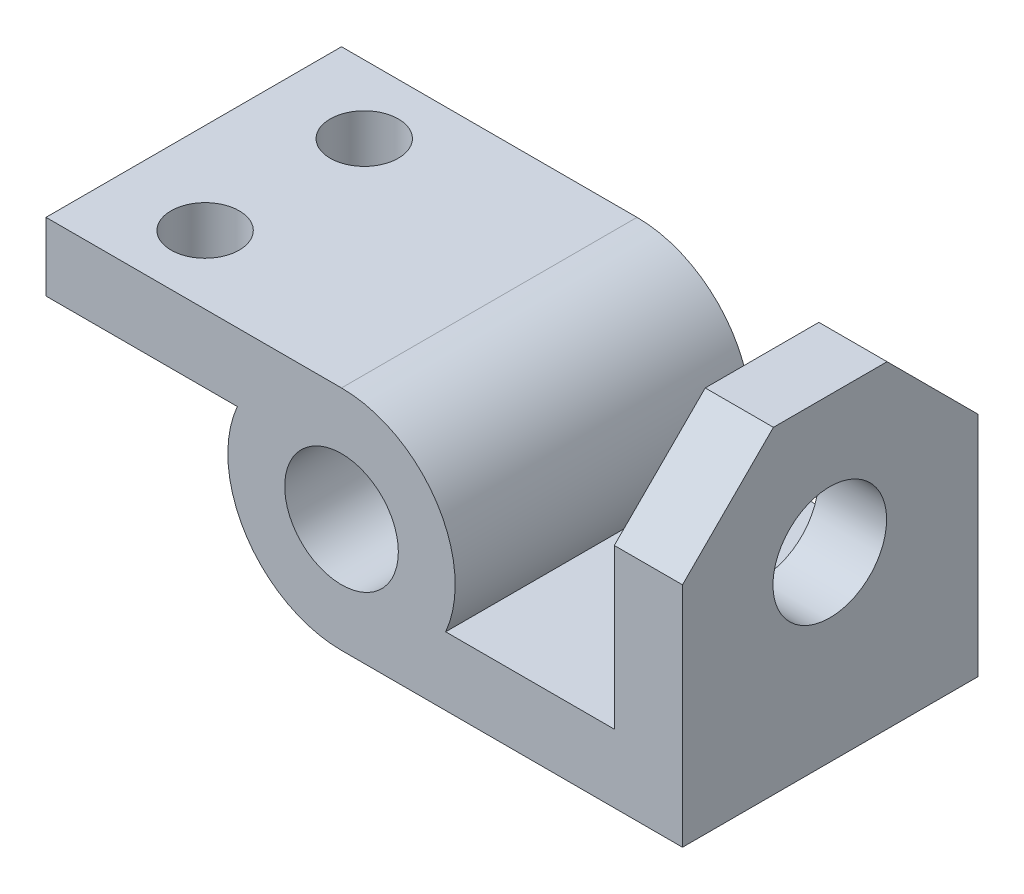
ISO-10303-21;
HEADER;
FILE_DESCRIPTION(('STEP AP214'),'2;1');
FILE_NAME('part.step','',(''),(''),'','','');
FILE_SCHEMA(('AUTOMOTIVE_DESIGN { 1 0 10303 214 1 1 1 1 }'));
ENDSEC;
DATA;
#1=APPLICATION_CONTEXT('core data for automotive mechanical design processes');
#2=APPLICATION_PROTOCOL_DEFINITION('international standard','automotive_design',2000,#1);
#3=PRODUCT_CONTEXT('',#1,'mechanical');
#4=PRODUCT('Part','Part','',(#3));
#5=PRODUCT_RELATED_PRODUCT_CATEGORY('part','',(#4));
#6=PRODUCT_DEFINITION_FORMATION('','',#4);
#7=PRODUCT_DEFINITION_CONTEXT('part definition',#1,'design');
#8=PRODUCT_DEFINITION('design','',#6,#7);
#9=PRODUCT_DEFINITION_SHAPE('','',#8);
#10=(LENGTH_UNIT() NAMED_UNIT(*) SI_UNIT(.MILLI.,.METRE.));
#11=(NAMED_UNIT(*) PLANE_ANGLE_UNIT() SI_UNIT($,.RADIAN.));
#12=(NAMED_UNIT(*) SI_UNIT($,.STERADIAN.) SOLID_ANGLE_UNIT());
#13=UNCERTAINTY_MEASURE_WITH_UNIT(LENGTH_MEASURE(1.E-05),#10,'distance_accuracy_value','');
#14=(GEOMETRIC_REPRESENTATION_CONTEXT(3) GLOBAL_UNCERTAINTY_ASSIGNED_CONTEXT((#13)) GLOBAL_UNIT_ASSIGNED_CONTEXT((#10,
#11,#12)) REPRESENTATION_CONTEXT('',''));
#15=CARTESIAN_POINT('',(0.,0.,0.));
#16=DIRECTION('',(0.,0.,1.));
#17=DIRECTION('',(1.,0.,0.));
#18=AXIS2_PLACEMENT_3D('',#15,#16,#17);
#19=CARTESIAN_POINT('',(0.,0.,82.55));
#20=DIRECTION('',(0.,0.,1.));
#21=DIRECTION('',(1.,0.,0.));
#22=AXIS2_PLACEMENT_3D('',#19,#20,#21);
#23=PLANE('',#22);
#24=DIRECTION('',(0.,1.,0.));
#25=VECTOR('',#24,1.);
#26=CARTESIAN_POINT('',(95.25,-31.75,82.55));
#27=LINE('',#26,#25);
#28=CARTESIAN_POINT('',(95.25,-31.75,82.55));
#29=VERTEX_POINT('',#28);
#30=CARTESIAN_POINT('',(95.25,31.75,82.55));
#31=VERTEX_POINT('',#30);
#32=EDGE_CURVE('E275',#29,#31,#27,.T.);
#33=ORIENTED_EDGE('',*,*,#32,.T.);
#34=DIRECTION('',(-1.,0.,0.));
#35=VECTOR('',#34,1.);
#36=CARTESIAN_POINT('',(76.2,31.75,82.55));
#37=LINE('',#36,#35);
#38=CARTESIAN_POINT('',(76.2,31.75,82.55));
#39=VERTEX_POINT('',#38);
#40=EDGE_CURVE('E11',#31,#39,#37,.T.);
#41=ORIENTED_EDGE('',*,*,#40,.T.);
#42=DIRECTION('',(0.,-1.,0.));
#43=VECTOR('',#42,1.);
#44=CARTESIAN_POINT('',(76.2,57.15,82.55));
#45=LINE('',#44,#43);
#46=CARTESIAN_POINT('',(76.2,-12.7,82.55));
#47=VERTEX_POINT('',#46);
#48=EDGE_CURVE('E278',#39,#47,#45,.T.);
#49=ORIENTED_EDGE('',*,*,#48,.T.);
#50=DIRECTION('',(-1.,0.,0.));
#51=VECTOR('',#50,1.);
#52=CARTESIAN_POINT('',(76.2,-12.7,82.55));
#53=LINE('',#52,#51);
#54=CARTESIAN_POINT('',(29.0993556629696,-12.7,82.55));
#55=VERTEX_POINT('',#54);
#56=EDGE_CURVE('E159',#47,#55,#53,.T.);
#57=ORIENTED_EDGE('',*,*,#56,.T.);
#58=CARTESIAN_POINT('',(0.,0.,82.55));
#59=DIRECTION('',(0.,0.,1.));
#60=DIRECTION('',(1.,0.,0.));
#61=AXIS2_PLACEMENT_3D('',#58,#59,#60);
#62=CIRCLE('',#61,31.75);
#63=CARTESIAN_POINT('',(0.,31.75,82.55));
#64=VERTEX_POINT('',#63);
#65=EDGE_CURVE('E154',#55,#64,#62,.T.);
#66=ORIENTED_EDGE('',*,*,#65,.T.);
#67=DIRECTION('',(-1.,0.,0.));
#68=VECTOR('',#67,1.);
#69=CARTESIAN_POINT('',(0.,31.75,82.55));
#70=LINE('',#69,#68);
#71=CARTESIAN_POINT('',(-82.55,31.75,82.55));
#72=VERTEX_POINT('',#71);
#73=EDGE_CURVE('E142',#64,#72,#70,.T.);
#74=ORIENTED_EDGE('',*,*,#73,.T.);
#75=DIRECTION('',(0.,-1.,0.));
#76=VECTOR('',#75,1.);
#77=CARTESIAN_POINT('',(-82.55,31.75,82.55));
#78=LINE('',#77,#76);
#79=CARTESIAN_POINT('',(-82.55,12.7,82.55));
#80=VERTEX_POINT('',#79);
#81=EDGE_CURVE('E153',#72,#80,#78,.T.);
#82=ORIENTED_EDGE('',*,*,#81,.T.);
#83=DIRECTION('',(1.,0.,0.));
#84=VECTOR('',#83,1.);
#85=CARTESIAN_POINT('',(-82.55,12.7,82.55));
#86=LINE('',#85,#84);
#87=CARTESIAN_POINT('',(-29.0993556629696,12.7,82.55));
#88=VERTEX_POINT('',#87);
#89=EDGE_CURVE('E254',#80,#88,#86,.T.);
#90=ORIENTED_EDGE('',*,*,#89,.T.);
#91=CARTESIAN_POINT('',(0.,0.,82.55));
#92=DIRECTION('',(0.,0.,1.));
#93=DIRECTION('',(1.,0.,0.));
#94=AXIS2_PLACEMENT_3D('',#91,#92,#93);
#95=CIRCLE('',#94,31.75);
#96=CARTESIAN_POINT('',(0.,-31.75,82.55));
#97=VERTEX_POINT('',#96);
#98=EDGE_CURVE('E284',#88,#97,#95,.T.);
#99=ORIENTED_EDGE('',*,*,#98,.T.);
#100=DIRECTION('',(1.,0.,0.));
#101=VECTOR('',#100,1.);
#102=CARTESIAN_POINT('',(0.,-31.75,82.55));
#103=LINE('',#102,#101);
#104=EDGE_CURVE('E279',#97,#29,#103,.T.);
#105=ORIENTED_EDGE('',*,*,#104,.T.);
#106=EDGE_LOOP('',(#33,#41,#49,#57,#66,#74,#82,#90,#99,#105));
#107=FACE_BOUND('',#106,.T.);
#108=CARTESIAN_POINT('',(0.,0.,82.55));
#109=DIRECTION('',(0.,0.,1.));
#110=DIRECTION('',(1.,0.,0.));
#111=AXIS2_PLACEMENT_3D('',#108,#109,#110);
#112=CIRCLE('',#111,15.875);
#113=CARTESIAN_POINT('',(15.875,0.,82.55));
#114=VERTEX_POINT('',#113);
#115=EDGE_CURVE('E291',#114,#114,#112,.T.);
#116=ORIENTED_EDGE('',*,*,#115,.F.);
#117=EDGE_LOOP('',(#116));
#118=FACE_BOUND('',#117,.T.);
#119=ADVANCED_FACE('F47',(#107,#118),#23,.T.);
#120=CARTESIAN_POINT('',(0.,0.,0.));
#121=DIRECTION('',(0.,0.,1.));
#122=DIRECTION('',(1.,0.,0.));
#123=AXIS2_PLACEMENT_3D('',#120,#121,#122);
#124=PLANE('',#123);
#125=DIRECTION('',(0.,-1.,0.));
#126=VECTOR('',#125,1.);
#127=CARTESIAN_POINT('',(76.2,57.15,0.));
#128=LINE('',#127,#126);
#129=CARTESIAN_POINT('',(76.2,31.75,0.));
#130=VERTEX_POINT('',#129);
#131=CARTESIAN_POINT('',(76.2,-12.7,0.));
#132=VERTEX_POINT('',#131);
#133=EDGE_CURVE('E214',#130,#132,#128,.T.);
#134=ORIENTED_EDGE('',*,*,#133,.F.);
#135=DIRECTION('',(1.,0.,0.));
#136=VECTOR('',#135,1.);
#137=CARTESIAN_POINT('',(0.,31.75,0.));
#138=LINE('',#137,#136);
#139=CARTESIAN_POINT('',(95.25,31.75,0.));
#140=VERTEX_POINT('',#139);
#141=EDGE_CURVE('E72',#130,#140,#138,.T.);
#142=ORIENTED_EDGE('',*,*,#141,.T.);
#143=DIRECTION('',(0.,1.,0.));
#144=VECTOR('',#143,1.);
#145=CARTESIAN_POINT('',(95.25,-31.75,0.));
#146=LINE('',#145,#144);
#147=CARTESIAN_POINT('',(95.25,-31.75,0.));
#148=VERTEX_POINT('',#147);
#149=EDGE_CURVE('E198',#148,#140,#146,.T.);
#150=ORIENTED_EDGE('',*,*,#149,.F.);
#151=DIRECTION('',(1.,0.,0.));
#152=VECTOR('',#151,1.);
#153=CARTESIAN_POINT('',(0.,-31.75,0.));
#154=LINE('',#153,#152);
#155=CARTESIAN_POINT('',(0.,-31.75,0.));
#156=VERTEX_POINT('',#155);
#157=EDGE_CURVE('E224',#156,#148,#154,.T.);
#158=ORIENTED_EDGE('',*,*,#157,.F.);
#159=CARTESIAN_POINT('',(0.,0.,0.));
#160=DIRECTION('',(0.,0.,1.));
#161=DIRECTION('',(1.,0.,0.));
#162=AXIS2_PLACEMENT_3D('',#159,#160,#161);
#163=CIRCLE('',#162,31.75);
#164=CARTESIAN_POINT('',(-29.0993556629696,12.7,0.));
#165=VERTEX_POINT('',#164);
#166=EDGE_CURVE('E260',#165,#156,#163,.T.);
#167=ORIENTED_EDGE('',*,*,#166,.F.);
#168=DIRECTION('',(1.,0.,0.));
#169=VECTOR('',#168,1.);
#170=CARTESIAN_POINT('',(-82.55,12.7,0.));
#171=LINE('',#170,#169);
#172=CARTESIAN_POINT('',(-82.55,12.7,0.));
#173=VERTEX_POINT('',#172);
#174=EDGE_CURVE('E253',#173,#165,#171,.T.);
#175=ORIENTED_EDGE('',*,*,#174,.F.);
#176=DIRECTION('',(0.,-1.,0.));
#177=VECTOR('',#176,1.);
#178=CARTESIAN_POINT('',(-82.55,31.75,0.));
#179=LINE('',#178,#177);
#180=CARTESIAN_POINT('',(-82.55,31.75,0.));
#181=VERTEX_POINT('',#180);
#182=EDGE_CURVE('E258',#181,#173,#179,.T.);
#183=ORIENTED_EDGE('',*,*,#182,.F.);
#184=DIRECTION('',(-1.,0.,0.));
#185=VECTOR('',#184,1.);
#186=CARTESIAN_POINT('',(0.,31.75,0.));
#187=LINE('',#186,#185);
#188=CARTESIAN_POINT('',(0.,31.75,0.));
#189=VERTEX_POINT('',#188);
#190=EDGE_CURVE('E266',#189,#181,#187,.T.);
#191=ORIENTED_EDGE('',*,*,#190,.F.);
#192=CARTESIAN_POINT('',(0.,0.,0.));
#193=DIRECTION('',(0.,0.,1.));
#194=DIRECTION('',(1.,0.,0.));
#195=AXIS2_PLACEMENT_3D('',#192,#193,#194);
#196=CIRCLE('',#195,31.75);
#197=CARTESIAN_POINT('',(29.0993556629696,-12.7,0.));
#198=VERTEX_POINT('',#197);
#199=EDGE_CURVE('E168',#198,#189,#196,.T.);
#200=ORIENTED_EDGE('',*,*,#199,.F.);
#201=DIRECTION('',(-1.,0.,0.));
#202=VECTOR('',#201,1.);
#203=CARTESIAN_POINT('',(76.2,-12.7,0.));
#204=LINE('',#203,#202);
#205=EDGE_CURVE('E164',#132,#198,#204,.T.);
#206=ORIENTED_EDGE('',*,*,#205,.F.);
#207=EDGE_LOOP('',(#134,#142,#150,#158,#167,#175,#183,#191,#200,#206));
#208=FACE_BOUND('',#207,.T.);
#209=CARTESIAN_POINT('',(0.,0.,0.));
#210=DIRECTION('',(0.,0.,1.));
#211=DIRECTION('',(1.,0.,0.));
#212=AXIS2_PLACEMENT_3D('',#209,#210,#211);
#213=CIRCLE('',#212,15.875);
#214=CARTESIAN_POINT('',(15.875,0.,0.));
#215=VERTEX_POINT('',#214);
#216=EDGE_CURVE('E353',#215,#215,#213,.T.);
#217=ORIENTED_EDGE('',*,*,#216,.T.);
#218=EDGE_LOOP('',(#217));
#219=FACE_BOUND('',#218,.T.);
#220=ADVANCED_FACE('F217',(#208,#219),#124,.F.);
#221=CARTESIAN_POINT('',(0.,0.,82.55));
#222=DIRECTION('',(0.,0.,-1.));
#223=DIRECTION('',(-1.,0.,0.));
#224=AXIS2_PLACEMENT_3D('',#221,#222,#223);
#225=CYLINDRICAL_SURFACE('',#224,31.75);
#226=ORIENTED_EDGE('',*,*,#199,.T.);
#227=DIRECTION('',(0.,0.,-1.));
#228=VECTOR('',#227,1.);
#229=CARTESIAN_POINT('',(0.,31.75,82.55));
#230=LINE('',#229,#228);
#231=EDGE_CURVE('E146',#64,#189,#230,.T.);
#232=ORIENTED_EDGE('',*,*,#231,.F.);
#233=ORIENTED_EDGE('',*,*,#65,.F.);
#234=DIRECTION('',(0.,0.,-1.));
#235=VECTOR('',#234,1.);
#236=CARTESIAN_POINT('',(29.0993556629696,-12.7,82.55));
#237=LINE('',#236,#235);
#238=EDGE_CURVE('E228',#55,#198,#237,.T.);
#239=ORIENTED_EDGE('',*,*,#238,.T.);
#240=EDGE_LOOP('',(#226,#232,#233,#239));
#241=FACE_BOUND('',#240,.T.);
#242=ADVANCED_FACE('F166',(#241),#225,.T.);
#243=CARTESIAN_POINT('',(0.,31.75,82.55));
#244=DIRECTION('',(0.,-1.,0.));
#245=DIRECTION('',(1.,0.,0.));
#246=AXIS2_PLACEMENT_3D('',#243,#244,#245);
#247=PLANE('',#246);
#248=CARTESIAN_POINT('',(-57.15,31.75,63.5));
#249=DIRECTION('',(0.,1.,0.));
#250=DIRECTION('',(-1.,0.,0.));
#251=AXIS2_PLACEMENT_3D('',#248,#249,#250);
#252=CIRCLE('',#251,9.525);
#253=CARTESIAN_POINT('',(-66.675,31.75,63.5));
#254=VERTEX_POINT('',#253);
#255=EDGE_CURVE('E354',#254,#254,#252,.T.);
#256=ORIENTED_EDGE('',*,*,#255,.F.);
#257=EDGE_LOOP('',(#256));
#258=FACE_BOUND('',#257,.T.);
#259=CARTESIAN_POINT('',(-57.15,31.75,19.05));
#260=DIRECTION('',(0.,1.,0.));
#261=DIRECTION('',(-1.,0.,0.));
#262=AXIS2_PLACEMENT_3D('',#259,#260,#261);
#263=CIRCLE('',#262,9.525);
#264=CARTESIAN_POINT('',(-66.675,31.75,19.05));
#265=VERTEX_POINT('',#264);
#266=EDGE_CURVE('E358',#265,#265,#263,.T.);
#267=ORIENTED_EDGE('',*,*,#266,.F.);
#268=EDGE_LOOP('',(#267));
#269=FACE_BOUND('',#268,.T.);
#270=ORIENTED_EDGE('',*,*,#190,.T.);
#271=DIRECTION('',(0.,0.,-1.));
#272=VECTOR('',#271,1.);
#273=CARTESIAN_POINT('',(-82.55,31.75,82.55));
#274=LINE('',#273,#272);
#275=EDGE_CURVE('E149',#72,#181,#274,.T.);
#276=ORIENTED_EDGE('',*,*,#275,.F.);
#277=ORIENTED_EDGE('',*,*,#73,.F.);
#278=ORIENTED_EDGE('',*,*,#231,.T.);
#279=EDGE_LOOP('',(#270,#276,#277,#278));
#280=FACE_BOUND('',#279,.T.);
#281=ADVANCED_FACE('F144',(#258,#269,#280),#247,.F.);
#282=CARTESIAN_POINT('',(-82.55,31.75,82.55));
#283=DIRECTION('',(1.,0.,0.));
#284=DIRECTION('',(0.,0.,-1.));
#285=AXIS2_PLACEMENT_3D('',#282,#283,#284);
#286=PLANE('',#285);
#287=ORIENTED_EDGE('',*,*,#182,.T.);
#288=DIRECTION('',(0.,0.,-1.));
#289=VECTOR('',#288,1.);
#290=CARTESIAN_POINT('',(-82.55,12.7,82.55));
#291=LINE('',#290,#289);
#292=EDGE_CURVE('E176',#80,#173,#291,.T.);
#293=ORIENTED_EDGE('',*,*,#292,.F.);
#294=ORIENTED_EDGE('',*,*,#81,.F.);
#295=ORIENTED_EDGE('',*,*,#275,.T.);
#296=EDGE_LOOP('',(#287,#293,#294,#295));
#297=FACE_BOUND('',#296,.T.);
#298=ADVANCED_FACE('F293',(#297),#286,.F.);
#299=CARTESIAN_POINT('',(-82.55,12.7,82.55));
#300=DIRECTION('',(0.,1.,0.));
#301=DIRECTION('',(0.,0.,1.));
#302=AXIS2_PLACEMENT_3D('',#299,#300,#301);
#303=PLANE('',#302);
#304=CARTESIAN_POINT('',(-57.15,12.7,63.5));
#305=DIRECTION('',(0.,1.,0.));
#306=DIRECTION('',(-1.,0.,0.));
#307=AXIS2_PLACEMENT_3D('',#304,#305,#306);
#308=CIRCLE('',#307,9.525);
#309=CARTESIAN_POINT('',(-66.675,12.7,63.5));
#310=VERTEX_POINT('',#309);
#311=EDGE_CURVE('E349',#310,#310,#308,.T.);
#312=ORIENTED_EDGE('',*,*,#311,.T.);
#313=EDGE_LOOP('',(#312));
#314=FACE_BOUND('',#313,.T.);
#315=CARTESIAN_POINT('',(-57.15,12.7,19.05));
#316=DIRECTION('',(0.,1.,0.));
#317=DIRECTION('',(-1.,0.,0.));
#318=AXIS2_PLACEMENT_3D('',#315,#316,#317);
#319=CIRCLE('',#318,9.525);
#320=CARTESIAN_POINT('',(-66.675,12.7,19.05));
#321=VERTEX_POINT('',#320);
#322=EDGE_CURVE('E346',#321,#321,#319,.T.);
#323=ORIENTED_EDGE('',*,*,#322,.T.);
#324=EDGE_LOOP('',(#323));
#325=FACE_BOUND('',#324,.T.);
#326=ORIENTED_EDGE('',*,*,#174,.T.);
#327=DIRECTION('',(0.,0.,-1.));
#328=VECTOR('',#327,1.);
#329=CARTESIAN_POINT('',(-29.0993556629696,12.7,82.55));
#330=LINE('',#329,#328);
#331=EDGE_CURVE('E242',#88,#165,#330,.T.);
#332=ORIENTED_EDGE('',*,*,#331,.F.);
#333=ORIENTED_EDGE('',*,*,#89,.F.);
#334=ORIENTED_EDGE('',*,*,#292,.T.);
#335=EDGE_LOOP('',(#326,#332,#333,#334));
#336=FACE_BOUND('',#335,.T.);
#337=ADVANCED_FACE('F251',(#314,#325,#336),#303,.F.);
#338=CARTESIAN_POINT('',(0.,0.,82.55));
#339=DIRECTION('',(0.,0.,-1.));
#340=DIRECTION('',(-1.,0.,0.));
#341=AXIS2_PLACEMENT_3D('',#338,#339,#340);
#342=CYLINDRICAL_SURFACE('',#341,31.75);
#343=ORIENTED_EDGE('',*,*,#166,.T.);
#344=DIRECTION('',(0.,0.,-1.));
#345=VECTOR('',#344,1.);
#346=CARTESIAN_POINT('',(0.,-31.75,82.55));
#347=LINE('',#346,#345);
#348=EDGE_CURVE('E238',#97,#156,#347,.T.);
#349=ORIENTED_EDGE('',*,*,#348,.F.);
#350=ORIENTED_EDGE('',*,*,#98,.F.);
#351=ORIENTED_EDGE('',*,*,#331,.T.);
#352=EDGE_LOOP('',(#343,#349,#350,#351));
#353=FACE_BOUND('',#352,.T.);
#354=ADVANCED_FACE('F301',(#353),#342,.T.);
#355=CARTESIAN_POINT('',(0.,-31.75,82.55));
#356=DIRECTION('',(0.,1.,0.));
#357=DIRECTION('',(0.,0.,1.));
#358=AXIS2_PLACEMENT_3D('',#355,#356,#357);
#359=PLANE('',#358);
#360=ORIENTED_EDGE('',*,*,#157,.T.);
#361=DIRECTION('',(0.,0.,-1.));
#362=VECTOR('',#361,1.);
#363=CARTESIAN_POINT('',(95.25,-31.75,82.55));
#364=LINE('',#363,#362);
#365=EDGE_CURVE('E207',#29,#148,#364,.T.);
#366=ORIENTED_EDGE('',*,*,#365,.F.);
#367=ORIENTED_EDGE('',*,*,#104,.F.);
#368=ORIENTED_EDGE('',*,*,#348,.T.);
#369=EDGE_LOOP('',(#360,#366,#367,#368));
#370=FACE_BOUND('',#369,.T.);
#371=ADVANCED_FACE('F272',(#370),#359,.F.);
#372=CARTESIAN_POINT('',(95.25,-31.75,82.55));
#373=DIRECTION('',(-1.,0.,0.));
#374=DIRECTION('',(0.,0.,1.));
#375=AXIS2_PLACEMENT_3D('',#372,#373,#374);
#376=PLANE('',#375);
#377=CARTESIAN_POINT('',(95.25,19.05,41.402));
#378=DIRECTION('',(1.,0.,0.));
#379=DIRECTION('',(0.,0.,-1.));
#380=AXIS2_PLACEMENT_3D('',#377,#378,#379);
#381=CIRCLE('',#380,15.875);
#382=CARTESIAN_POINT('',(95.25,19.05,25.527));
#383=VERTEX_POINT('',#382);
#384=EDGE_CURVE('E339',#383,#383,#381,.T.);
#385=ORIENTED_EDGE('',*,*,#384,.F.);
#386=EDGE_LOOP('',(#385));
#387=FACE_BOUND('',#386,.T.);
#388=ORIENTED_EDGE('',*,*,#149,.T.);
#389=DIRECTION('',(0.,-0.707106781186548,-0.707106781186548));
#390=VECTOR('',#389,1.);
#391=CARTESIAN_POINT('',(95.25,57.15,25.4));
#392=LINE('',#391,#390);
#393=CARTESIAN_POINT('',(95.25,57.15,25.4));
#394=VERTEX_POINT('',#393);
#395=EDGE_CURVE('E57',#140,#394,#392,.F.);
#396=ORIENTED_EDGE('',*,*,#395,.T.);
#397=DIRECTION('',(0.,0.,-1.));
#398=VECTOR('',#397,1.);
#399=CARTESIAN_POINT('',(95.25,57.15,82.55));
#400=LINE('',#399,#398);
#401=CARTESIAN_POINT('',(95.25,57.15,57.15));
#402=VERTEX_POINT('',#401);
#403=EDGE_CURVE('E196',#402,#394,#400,.T.);
#404=ORIENTED_EDGE('',*,*,#403,.F.);
#405=DIRECTION('',(0.,-0.707106781186548,0.707106781186548));
#406=VECTOR('',#405,1.);
#407=CARTESIAN_POINT('',(95.25,31.75,82.55));
#408=LINE('',#407,#406);
#409=EDGE_CURVE('E64',#402,#31,#408,.T.);
#410=ORIENTED_EDGE('',*,*,#409,.T.);
#411=ORIENTED_EDGE('',*,*,#32,.F.);
#412=ORIENTED_EDGE('',*,*,#365,.T.);
#413=EDGE_LOOP('',(#388,#396,#404,#410,#411,#412));
#414=FACE_BOUND('',#413,.T.);
#415=ADVANCED_FACE('F195',(#387,#414),#376,.F.);
#416=CARTESIAN_POINT('',(95.25,57.15,82.55));
#417=DIRECTION('',(0.,-1.,0.));
#418=DIRECTION('',(0.,0.,-1.));
#419=AXIS2_PLACEMENT_3D('',#416,#417,#418);
#420=PLANE('',#419);
#421=ORIENTED_EDGE('',*,*,#403,.T.);
#422=DIRECTION('',(-1.,0.,0.));
#423=VECTOR('',#422,1.);
#424=CARTESIAN_POINT('',(95.25,57.15,25.4));
#425=LINE('',#424,#423);
#426=CARTESIAN_POINT('',(76.2,57.15,25.4));
#427=VERTEX_POINT('',#426);
#428=EDGE_CURVE('E174',#394,#427,#425,.T.);
#429=ORIENTED_EDGE('',*,*,#428,.T.);
#430=DIRECTION('',(0.,0.,-1.));
#431=VECTOR('',#430,1.);
#432=CARTESIAN_POINT('',(76.2,57.15,82.55));
#433=LINE('',#432,#431);
#434=CARTESIAN_POINT('',(76.2,57.15,57.15));
#435=VERTEX_POINT('',#434);
#436=EDGE_CURVE('E208',#435,#427,#433,.T.);
#437=ORIENTED_EDGE('',*,*,#436,.F.);
#438=DIRECTION('',(1.,0.,0.));
#439=VECTOR('',#438,1.);
#440=CARTESIAN_POINT('',(95.25,57.15,57.15));
#441=LINE('',#440,#439);
#442=EDGE_CURVE('E170',#435,#402,#441,.T.);
#443=ORIENTED_EDGE('',*,*,#442,.T.);
#444=EDGE_LOOP('',(#421,#429,#437,#443));
#445=FACE_BOUND('',#444,.T.);
#446=ADVANCED_FACE('F202',(#445),#420,.F.);
#447=CARTESIAN_POINT('',(76.2,57.15,82.55));
#448=DIRECTION('',(1.,0.,0.));
#449=DIRECTION('',(0.,0.,-1.));
#450=AXIS2_PLACEMENT_3D('',#447,#448,#449);
#451=PLANE('',#450);
#452=CARTESIAN_POINT('',(76.2,19.05,41.402));
#453=DIRECTION('',(1.,0.,0.));
#454=DIRECTION('',(0.,0.,-1.));
#455=AXIS2_PLACEMENT_3D('',#452,#453,#454);
#456=CIRCLE('',#455,15.875);
#457=CARTESIAN_POINT('',(76.2,19.05,25.527));
#458=VERTEX_POINT('',#457);
#459=EDGE_CURVE('E342',#458,#458,#456,.T.);
#460=ORIENTED_EDGE('',*,*,#459,.T.);
#461=EDGE_LOOP('',(#460));
#462=FACE_BOUND('',#461,.T.);
#463=ORIENTED_EDGE('',*,*,#436,.T.);
#464=DIRECTION('',(0.,0.707106781186548,0.707106781186548));
#465=VECTOR('',#464,1.);
#466=CARTESIAN_POINT('',(76.2,57.15,25.4));
#467=LINE('',#466,#465);
#468=EDGE_CURVE('E186',#427,#130,#467,.F.);
#469=ORIENTED_EDGE('',*,*,#468,.T.);
#470=ORIENTED_EDGE('',*,*,#133,.T.);
#471=DIRECTION('',(0.,0.,-1.));
#472=VECTOR('',#471,1.);
#473=CARTESIAN_POINT('',(76.2,-12.7,82.55));
#474=LINE('',#473,#472);
#475=EDGE_CURVE('E231',#47,#132,#474,.T.);
#476=ORIENTED_EDGE('',*,*,#475,.F.);
#477=ORIENTED_EDGE('',*,*,#48,.F.);
#478=DIRECTION('',(0.,0.707106781186548,-0.707106781186548));
#479=VECTOR('',#478,1.);
#480=CARTESIAN_POINT('',(76.2,31.75,82.55));
#481=LINE('',#480,#479);
#482=EDGE_CURVE('E183',#39,#435,#481,.T.);
#483=ORIENTED_EDGE('',*,*,#482,.T.);
#484=EDGE_LOOP('',(#463,#469,#470,#476,#477,#483));
#485=FACE_BOUND('',#484,.T.);
#486=ADVANCED_FACE('F212',(#462,#485),#451,.F.);
#487=CARTESIAN_POINT('',(76.2,-12.7,82.55));
#488=DIRECTION('',(0.,-1.,0.));
#489=DIRECTION('',(1.,0.,0.));
#490=AXIS2_PLACEMENT_3D('',#487,#488,#489);
#491=PLANE('',#490);
#492=ORIENTED_EDGE('',*,*,#205,.T.);
#493=ORIENTED_EDGE('',*,*,#238,.F.);
#494=ORIENTED_EDGE('',*,*,#56,.F.);
#495=ORIENTED_EDGE('',*,*,#475,.T.);
#496=EDGE_LOOP('',(#492,#493,#494,#495));
#497=FACE_BOUND('',#496,.T.);
#498=ADVANCED_FACE('F323',(#497),#491,.F.);
#499=CARTESIAN_POINT('',(0.,0.,82.55));
#500=DIRECTION('',(0.,0.,-1.));
#501=DIRECTION('',(-1.,0.,0.));
#502=AXIS2_PLACEMENT_3D('',#499,#500,#501);
#503=CYLINDRICAL_SURFACE('',#502,15.875);
#504=ORIENTED_EDGE('',*,*,#115,.T.);
#505=EDGE_LOOP('',(#504));
#506=FACE_BOUND('',#505,.T.);
#507=ORIENTED_EDGE('',*,*,#216,.F.);
#508=EDGE_LOOP('',(#507));
#509=FACE_BOUND('',#508,.T.);
#510=ADVANCED_FACE('F320',(#506,#509),#503,.F.);
#511=CARTESIAN_POINT('',(-57.15,12.7,19.05));
#512=DIRECTION('',(0.,1.,0.));
#513=DIRECTION('',(-1.,0.,0.));
#514=AXIS2_PLACEMENT_3D('',#511,#512,#513);
#515=CYLINDRICAL_SURFACE('',#514,9.525);
#516=CARTESIAN_POINT('',(-66.675,12.7,19.05));
#517=CARTESIAN_POINT('',(-66.675,12.8984375,19.05));
#518=CARTESIAN_POINT('',(-66.675,13.096875,19.05));
#519=CARTESIAN_POINT('',(-66.675,13.49375,19.05));
#520=CARTESIAN_POINT('',(-66.675,13.6921875,19.05));
#521=CARTESIAN_POINT('',(-66.675,14.0890625,19.05));
#522=CARTESIAN_POINT('',(-66.675,14.2875,19.05));
#523=CARTESIAN_POINT('',(-66.675,14.684375,19.05));
#524=CARTESIAN_POINT('',(-66.675,14.8828125,19.05));
#525=CARTESIAN_POINT('',(-66.675,15.2796875,19.05));
#526=CARTESIAN_POINT('',(-66.675,15.478125,19.05));
#527=CARTESIAN_POINT('',(-66.675,15.875,19.05));
#528=CARTESIAN_POINT('',(-66.675,16.0734375,19.05));
#529=CARTESIAN_POINT('',(-66.675,16.4703125,19.05));
#530=CARTESIAN_POINT('',(-66.675,16.66875,19.05));
#531=CARTESIAN_POINT('',(-66.675,17.065625,19.05));
#532=CARTESIAN_POINT('',(-66.675,17.2640625,19.05));
#533=CARTESIAN_POINT('',(-66.675,17.6609375,19.05));
#534=CARTESIAN_POINT('',(-66.675,17.859375,19.05));
#535=CARTESIAN_POINT('',(-66.675,18.25625,19.05));
#536=CARTESIAN_POINT('',(-66.675,18.4546875,19.05));
#537=CARTESIAN_POINT('',(-66.675,18.8515625,19.05));
#538=CARTESIAN_POINT('',(-66.675,19.05,19.05));
#539=CARTESIAN_POINT('',(-66.675,19.446875,19.05));
#540=CARTESIAN_POINT('',(-66.675,19.6453125,19.05));
#541=CARTESIAN_POINT('',(-66.675,20.0421875,19.05));
#542=CARTESIAN_POINT('',(-66.675,20.240625,19.05));
#543=CARTESIAN_POINT('',(-66.675,20.6375,19.05));
#544=CARTESIAN_POINT('',(-66.675,20.8359375,19.05));
#545=CARTESIAN_POINT('',(-66.675,21.2328125,19.05));
#546=CARTESIAN_POINT('',(-66.675,21.43125,19.05));
#547=CARTESIAN_POINT('',(-66.675,21.828125,19.05));
#548=CARTESIAN_POINT('',(-66.675,22.0265625,19.05));
#549=CARTESIAN_POINT('',(-66.675,22.4234375,19.05));
#550=CARTESIAN_POINT('',(-66.675,22.621875,19.05));
#551=CARTESIAN_POINT('',(-66.675,23.01875,19.05));
#552=CARTESIAN_POINT('',(-66.675,23.2171875,19.05));
#553=CARTESIAN_POINT('',(-66.675,23.6140625,19.05));
#554=CARTESIAN_POINT('',(-66.675,23.8125,19.05));
#555=CARTESIAN_POINT('',(-66.675,24.209375,19.05));
#556=CARTESIAN_POINT('',(-66.675,24.4078125,19.05));
#557=CARTESIAN_POINT('',(-66.675,24.8046875,19.05));
#558=CARTESIAN_POINT('',(-66.675,25.003125,19.05));
#559=CARTESIAN_POINT('',(-66.675,25.4,19.05));
#560=CARTESIAN_POINT('',(-66.675,25.5984375,19.05));
#561=CARTESIAN_POINT('',(-66.675,25.9953125,19.05));
#562=CARTESIAN_POINT('',(-66.675,26.19375,19.05));
#563=CARTESIAN_POINT('',(-66.675,26.590625,19.05));
#564=CARTESIAN_POINT('',(-66.675,26.7890625,19.05));
#565=CARTESIAN_POINT('',(-66.675,27.1859375,19.05));
#566=CARTESIAN_POINT('',(-66.675,27.384375,19.05));
#567=CARTESIAN_POINT('',(-66.675,27.78125,19.05));
#568=CARTESIAN_POINT('',(-66.675,27.9796875,19.05));
#569=CARTESIAN_POINT('',(-66.675,28.3765625,19.05));
#570=CARTESIAN_POINT('',(-66.675,28.575,19.05));
#571=CARTESIAN_POINT('',(-66.675,28.971875,19.05));
#572=CARTESIAN_POINT('',(-66.675,29.1703125,19.05));
#573=CARTESIAN_POINT('',(-66.675,29.5671875,19.05));
#574=CARTESIAN_POINT('',(-66.675,29.765625,19.05));
#575=CARTESIAN_POINT('',(-66.675,30.1625,19.05));
#576=CARTESIAN_POINT('',(-66.675,30.3609375,19.05));
#577=CARTESIAN_POINT('',(-66.675,30.7578125,19.05));
#578=CARTESIAN_POINT('',(-66.675,30.95625,19.05));
#579=CARTESIAN_POINT('',(-66.675,31.353125,19.05));
#580=CARTESIAN_POINT('',(-66.675,31.5515625,19.05));
#581=CARTESIAN_POINT('',(-66.675,31.75,19.05));
#582=B_SPLINE_CURVE_WITH_KNOTS('',3,(#516,#517,#518,#519,#520,#521,#522,#523,#524,#525,#526,
#527,#528,#529,#530,#531,#532,#533,#534,#535,#536,#537,#538,#539,#540,#541,#542,#543,#544,#545,
#546,#547,#548,#549,#550,#551,#552,#553,#554,#555,#556,#557,#558,#559,#560,#561,#562,#563,#564,
#565,#566,#567,#568,#569,#570,#571,#572,#573,#574,#575,#576,#577,#578,#579,#580,#581),
.UNSPECIFIED.,.F.,.F.,(4,2,2,2,2,2,2,2,2,2,2,2,2,2,2,2,2,2,2,2,2,2,2,2,2,2,2,2,2,2,2,2,4),(0.,
0.5953125,1.190625,1.7859375,2.38125,2.9765625,3.571875,4.1671875,4.7625,5.3578125,5.953125,
6.5484375,7.14375,7.7390625,8.334375,8.9296875,9.525,10.1203125,10.715625,11.3109375,11.90625,
12.5015625,13.096875,13.6921875,14.2875,14.8828125,15.478125,16.0734375,16.66875,17.2640625,
17.859375,18.4546875,19.05),.UNSPECIFIED.);
#583=EDGE_CURVE('BSEAM373',#321,#265,#582,.T.);
#584=ORIENTED_EDGE('',*,*,#322,.F.);
#585=ORIENTED_EDGE('',*,*,#266,.T.);
#586=ORIENTED_EDGE('',*,*,#583,.T.);
#587=ORIENTED_EDGE('',*,*,#583,.F.);
#588=EDGE_LOOP('',(#584,#586,#585,#587));
#589=FACE_BOUND('',#588,.T.);
#590=ADVANCED_FACE('F373',(#589),#515,.F.);
#591=CARTESIAN_POINT('',(-57.15,12.7,63.5));
#592=DIRECTION('',(0.,1.,0.));
#593=DIRECTION('',(-1.,0.,0.));
#594=AXIS2_PLACEMENT_3D('',#591,#592,#593);
#595=CYLINDRICAL_SURFACE('',#594,9.525);
#596=CARTESIAN_POINT('',(-66.675,12.7,63.5));
#597=CARTESIAN_POINT('',(-66.675,12.8984375,63.5));
#598=CARTESIAN_POINT('',(-66.675,13.096875,63.5));
#599=CARTESIAN_POINT('',(-66.675,13.49375,63.5));
#600=CARTESIAN_POINT('',(-66.675,13.6921875,63.5));
#601=CARTESIAN_POINT('',(-66.675,14.0890625,63.5));
#602=CARTESIAN_POINT('',(-66.675,14.2875,63.5));
#603=CARTESIAN_POINT('',(-66.675,14.684375,63.5));
#604=CARTESIAN_POINT('',(-66.675,14.8828125,63.5));
#605=CARTESIAN_POINT('',(-66.675,15.2796875,63.5));
#606=CARTESIAN_POINT('',(-66.675,15.478125,63.5));
#607=CARTESIAN_POINT('',(-66.675,15.875,63.5));
#608=CARTESIAN_POINT('',(-66.675,16.0734375,63.5));
#609=CARTESIAN_POINT('',(-66.675,16.4703125,63.5));
#610=CARTESIAN_POINT('',(-66.675,16.66875,63.5));
#611=CARTESIAN_POINT('',(-66.675,17.065625,63.5));
#612=CARTESIAN_POINT('',(-66.675,17.2640625,63.5));
#613=CARTESIAN_POINT('',(-66.675,17.6609375,63.5));
#614=CARTESIAN_POINT('',(-66.675,17.859375,63.5));
#615=CARTESIAN_POINT('',(-66.675,18.25625,63.5));
#616=CARTESIAN_POINT('',(-66.675,18.4546875,63.5));
#617=CARTESIAN_POINT('',(-66.675,18.8515625,63.5));
#618=CARTESIAN_POINT('',(-66.675,19.05,63.5));
#619=CARTESIAN_POINT('',(-66.675,19.446875,63.5));
#620=CARTESIAN_POINT('',(-66.675,19.6453125,63.5));
#621=CARTESIAN_POINT('',(-66.675,20.0421875,63.5));
#622=CARTESIAN_POINT('',(-66.675,20.240625,63.5));
#623=CARTESIAN_POINT('',(-66.675,20.6375,63.5));
#624=CARTESIAN_POINT('',(-66.675,20.8359375,63.5));
#625=CARTESIAN_POINT('',(-66.675,21.2328125,63.5));
#626=CARTESIAN_POINT('',(-66.675,21.43125,63.5));
#627=CARTESIAN_POINT('',(-66.675,21.828125,63.5));
#628=CARTESIAN_POINT('',(-66.675,22.0265625,63.5));
#629=CARTESIAN_POINT('',(-66.675,22.4234375,63.5));
#630=CARTESIAN_POINT('',(-66.675,22.621875,63.5));
#631=CARTESIAN_POINT('',(-66.675,23.01875,63.5));
#632=CARTESIAN_POINT('',(-66.675,23.2171875,63.5));
#633=CARTESIAN_POINT('',(-66.675,23.6140625,63.5));
#634=CARTESIAN_POINT('',(-66.675,23.8125,63.5));
#635=CARTESIAN_POINT('',(-66.675,24.209375,63.5));
#636=CARTESIAN_POINT('',(-66.675,24.4078125,63.5));
#637=CARTESIAN_POINT('',(-66.675,24.8046875,63.5));
#638=CARTESIAN_POINT('',(-66.675,25.003125,63.5));
#639=CARTESIAN_POINT('',(-66.675,25.4,63.5));
#640=CARTESIAN_POINT('',(-66.675,25.5984375,63.5));
#641=CARTESIAN_POINT('',(-66.675,25.9953125,63.5));
#642=CARTESIAN_POINT('',(-66.675,26.19375,63.5));
#643=CARTESIAN_POINT('',(-66.675,26.590625,63.5));
#644=CARTESIAN_POINT('',(-66.675,26.7890625,63.5));
#645=CARTESIAN_POINT('',(-66.675,27.1859375,63.5));
#646=CARTESIAN_POINT('',(-66.675,27.384375,63.5));
#647=CARTESIAN_POINT('',(-66.675,27.78125,63.5));
#648=CARTESIAN_POINT('',(-66.675,27.9796875,63.5));
#649=CARTESIAN_POINT('',(-66.675,28.3765625,63.5));
#650=CARTESIAN_POINT('',(-66.675,28.575,63.5));
#651=CARTESIAN_POINT('',(-66.675,28.971875,63.5));
#652=CARTESIAN_POINT('',(-66.675,29.1703125,63.5));
#653=CARTESIAN_POINT('',(-66.675,29.5671875,63.5));
#654=CARTESIAN_POINT('',(-66.675,29.765625,63.5));
#655=CARTESIAN_POINT('',(-66.675,30.1625,63.5));
#656=CARTESIAN_POINT('',(-66.675,30.3609375,63.5));
#657=CARTESIAN_POINT('',(-66.675,30.7578125,63.5));
#658=CARTESIAN_POINT('',(-66.675,30.95625,63.5));
#659=CARTESIAN_POINT('',(-66.675,31.353125,63.5));
#660=CARTESIAN_POINT('',(-66.675,31.5515625,63.5));
#661=CARTESIAN_POINT('',(-66.675,31.75,63.5));
#662=B_SPLINE_CURVE_WITH_KNOTS('',3,(#596,#597,#598,#599,#600,#601,#602,#603,#604,#605,#606,
#607,#608,#609,#610,#611,#612,#613,#614,#615,#616,#617,#618,#619,#620,#621,#622,#623,#624,#625,
#626,#627,#628,#629,#630,#631,#632,#633,#634,#635,#636,#637,#638,#639,#640,#641,#642,#643,#644,
#645,#646,#647,#648,#649,#650,#651,#652,#653,#654,#655,#656,#657,#658,#659,#660,#661),
.UNSPECIFIED.,.F.,.F.,(4,2,2,2,2,2,2,2,2,2,2,2,2,2,2,2,2,2,2,2,2,2,2,2,2,2,2,2,2,2,2,2,4),(0.,
0.5953125,1.190625,1.7859375,2.38125,2.9765625,3.571875,4.1671875,4.7625,5.3578125,5.953125,
6.5484375,7.14375,7.7390625,8.334375,8.9296875,9.525,10.1203125,10.715625,11.3109375,11.90625,
12.5015625,13.096875,13.6921875,14.2875,14.8828125,15.478125,16.0734375,16.66875,17.2640625,
17.859375,18.4546875,19.05),.UNSPECIFIED.);
#663=EDGE_CURVE('BSEAM379',#310,#254,#662,.T.);
#664=ORIENTED_EDGE('',*,*,#311,.F.);
#665=ORIENTED_EDGE('',*,*,#255,.T.);
#666=ORIENTED_EDGE('',*,*,#663,.T.);
#667=ORIENTED_EDGE('',*,*,#663,.F.);
#668=EDGE_LOOP('',(#664,#666,#665,#667));
#669=FACE_BOUND('',#668,.T.);
#670=ADVANCED_FACE('F379',(#669),#595,.F.);
#671=CARTESIAN_POINT('',(95.25,57.15,25.4));
#672=DIRECTION('',(0.,-0.707106781186547,0.707106781186547));
#673=DIRECTION('',(-1.,0.,0.));
#674=AXIS2_PLACEMENT_3D('',#671,#672,#673);
#675=PLANE('',#674);
#676=ORIENTED_EDGE('',*,*,#395,.F.);
#677=ORIENTED_EDGE('',*,*,#141,.F.);
#678=ORIENTED_EDGE('',*,*,#468,.F.);
#679=ORIENTED_EDGE('',*,*,#428,.F.);
#680=EDGE_LOOP('',(#676,#677,#678,#679));
#681=FACE_BOUND('',#680,.T.);
#682=ADVANCED_FACE('F210',(#681),#675,.F.);
#683=CARTESIAN_POINT('',(0.,31.75,82.55));
#684=DIRECTION('',(0.,0.707106781186547,0.707106781186547));
#685=DIRECTION('',(1.,0.,0.));
#686=AXIS2_PLACEMENT_3D('',#683,#684,#685);
#687=PLANE('',#686);
#688=ORIENTED_EDGE('',*,*,#409,.F.);
#689=ORIENTED_EDGE('',*,*,#442,.F.);
#690=ORIENTED_EDGE('',*,*,#482,.F.);
#691=ORIENTED_EDGE('',*,*,#40,.F.);
#692=EDGE_LOOP('',(#688,#689,#690,#691));
#693=FACE_BOUND('',#692,.T.);
#694=ADVANCED_FACE('F50',(#693),#687,.T.);
#695=CARTESIAN_POINT('',(76.2,19.05,41.402));
#696=DIRECTION('',(1.,0.,0.));
#697=DIRECTION('',(0.,0.,-1.));
#698=AXIS2_PLACEMENT_3D('',#695,#696,#697);
#699=CYLINDRICAL_SURFACE('',#698,15.875);
#700=CARTESIAN_POINT('',(76.2,19.05,25.527));
#701=CARTESIAN_POINT('',(76.3984375,19.05,25.527));
#702=CARTESIAN_POINT('',(76.596875,19.05,25.527));
#703=CARTESIAN_POINT('',(76.99375,19.05,25.527));
#704=CARTESIAN_POINT('',(77.1921875,19.05,25.527));
#705=CARTESIAN_POINT('',(77.5890625,19.05,25.527));
#706=CARTESIAN_POINT('',(77.7875,19.05,25.527));
#707=CARTESIAN_POINT('',(78.184375,19.05,25.527));
#708=CARTESIAN_POINT('',(78.3828125,19.05,25.527));
#709=CARTESIAN_POINT('',(78.7796875,19.05,25.527));
#710=CARTESIAN_POINT('',(78.978125,19.05,25.527));
#711=CARTESIAN_POINT('',(79.375,19.05,25.527));
#712=CARTESIAN_POINT('',(79.5734375,19.05,25.527));
#713=CARTESIAN_POINT('',(79.9703125,19.05,25.527));
#714=CARTESIAN_POINT('',(80.16875,19.05,25.527));
#715=CARTESIAN_POINT('',(80.565625,19.05,25.527));
#716=CARTESIAN_POINT('',(80.7640625,19.05,25.527));
#717=CARTESIAN_POINT('',(81.1609375,19.05,25.527));
#718=CARTESIAN_POINT('',(81.359375,19.05,25.527));
#719=CARTESIAN_POINT('',(81.75625,19.05,25.527));
#720=CARTESIAN_POINT('',(81.9546875,19.05,25.527));
#721=CARTESIAN_POINT('',(82.3515625,19.05,25.527));
#722=CARTESIAN_POINT('',(82.55,19.05,25.527));
#723=CARTESIAN_POINT('',(82.946875,19.05,25.527));
#724=CARTESIAN_POINT('',(83.1453125,19.05,25.527));
#725=CARTESIAN_POINT('',(83.5421875,19.05,25.527));
#726=CARTESIAN_POINT('',(83.740625,19.05,25.527));
#727=CARTESIAN_POINT('',(84.1375,19.05,25.527));
#728=CARTESIAN_POINT('',(84.3359375,19.05,25.527));
#729=CARTESIAN_POINT('',(84.7328125,19.05,25.527));
#730=CARTESIAN_POINT('',(84.93125,19.05,25.527));
#731=CARTESIAN_POINT('',(85.328125,19.05,25.527));
#732=CARTESIAN_POINT('',(85.5265625,19.05,25.527));
#733=CARTESIAN_POINT('',(85.9234375,19.05,25.527));
#734=CARTESIAN_POINT('',(86.121875,19.05,25.527));
#735=CARTESIAN_POINT('',(86.51875,19.05,25.527));
#736=CARTESIAN_POINT('',(86.7171875,19.05,25.527));
#737=CARTESIAN_POINT('',(87.1140625,19.05,25.527));
#738=CARTESIAN_POINT('',(87.3125,19.05,25.527));
#739=CARTESIAN_POINT('',(87.709375,19.05,25.527));
#740=CARTESIAN_POINT('',(87.9078125,19.05,25.527));
#741=CARTESIAN_POINT('',(88.3046875,19.05,25.527));
#742=CARTESIAN_POINT('',(88.503125,19.05,25.527));
#743=CARTESIAN_POINT('',(88.9,19.05,25.527));
#744=CARTESIAN_POINT('',(89.0984375,19.05,25.527));
#745=CARTESIAN_POINT('',(89.4953125,19.05,25.527));
#746=CARTESIAN_POINT('',(89.69375,19.05,25.527));
#747=CARTESIAN_POINT('',(90.090625,19.05,25.527));
#748=CARTESIAN_POINT('',(90.2890625,19.05,25.527));
#749=CARTESIAN_POINT('',(90.6859375,19.05,25.527));
#750=CARTESIAN_POINT('',(90.884375,19.05,25.527));
#751=CARTESIAN_POINT('',(91.28125,19.05,25.527));
#752=CARTESIAN_POINT('',(91.4796875,19.05,25.527));
#753=CARTESIAN_POINT('',(91.8765625,19.05,25.527));
#754=CARTESIAN_POINT('',(92.075,19.05,25.527));
#755=CARTESIAN_POINT('',(92.471875,19.05,25.527));
#756=CARTESIAN_POINT('',(92.6703125,19.05,25.527));
#757=CARTESIAN_POINT('',(93.0671875,19.05,25.527));
#758=CARTESIAN_POINT('',(93.265625,19.05,25.527));
#759=CARTESIAN_POINT('',(93.6625,19.05,25.527));
#760=CARTESIAN_POINT('',(93.8609375,19.05,25.527));
#761=CARTESIAN_POINT('',(94.2578125,19.05,25.527));
#762=CARTESIAN_POINT('',(94.45625,19.05,25.527));
#763=CARTESIAN_POINT('',(94.853125,19.05,25.527));
#764=CARTESIAN_POINT('',(95.0515625,19.05,25.527));
#765=CARTESIAN_POINT('',(95.25,19.05,25.527));
#766=B_SPLINE_CURVE_WITH_KNOTS('',3,(#700,#701,#702,#703,#704,#705,#706,#707,#708,#709,#710,
#711,#712,#713,#714,#715,#716,#717,#718,#719,#720,#721,#722,#723,#724,#725,#726,#727,#728,#729,
#730,#731,#732,#733,#734,#735,#736,#737,#738,#739,#740,#741,#742,#743,#744,#745,#746,#747,#748,
#749,#750,#751,#752,#753,#754,#755,#756,#757,#758,#759,#760,#761,#762,#763,#764,#765),
.UNSPECIFIED.,.F.,.F.,(4,2,2,2,2,2,2,2,2,2,2,2,2,2,2,2,2,2,2,2,2,2,2,2,2,2,2,2,2,2,2,2,4),(0.,
0.5953125,1.190625,1.7859375,2.38125,2.9765625,3.571875,4.1671875,4.7625,5.3578125,5.953125,
6.5484375,7.14375,7.7390625,8.334375,8.92968750000001,9.52500000000001,10.1203125,10.715625,
11.3109375,11.90625,12.5015625,13.096875,13.6921875,14.2875,14.8828125,15.478125,16.0734375,
16.66875,17.2640625,17.859375,18.4546875,19.05),.UNSPECIFIED.);
#767=EDGE_CURVE('BSEAM389',#458,#383,#766,.T.);
#768=ORIENTED_EDGE('',*,*,#459,.F.);
#769=ORIENTED_EDGE('',*,*,#384,.T.);
#770=ORIENTED_EDGE('',*,*,#767,.T.);
#771=ORIENTED_EDGE('',*,*,#767,.F.);
#772=EDGE_LOOP('',(#768,#770,#769,#771));
#773=FACE_BOUND('',#772,.T.);
#774=ADVANCED_FACE('F389',(#773),#699,.F.);
#775=CLOSED_SHELL('',(#119,#220,#242,#281,#298,#337,#354,#371,#415,#446,#486,#498,#510,#590,
#670,#682,#694,#774));
#776=MANIFOLD_SOLID_BREP('B2',#775);
#777=ADVANCED_BREP_SHAPE_REPRESENTATION('',(#18,#776),#14);
#778=SHAPE_DEFINITION_REPRESENTATION(#9,#777);
ENDSEC;
END-ISO-10303-21;
